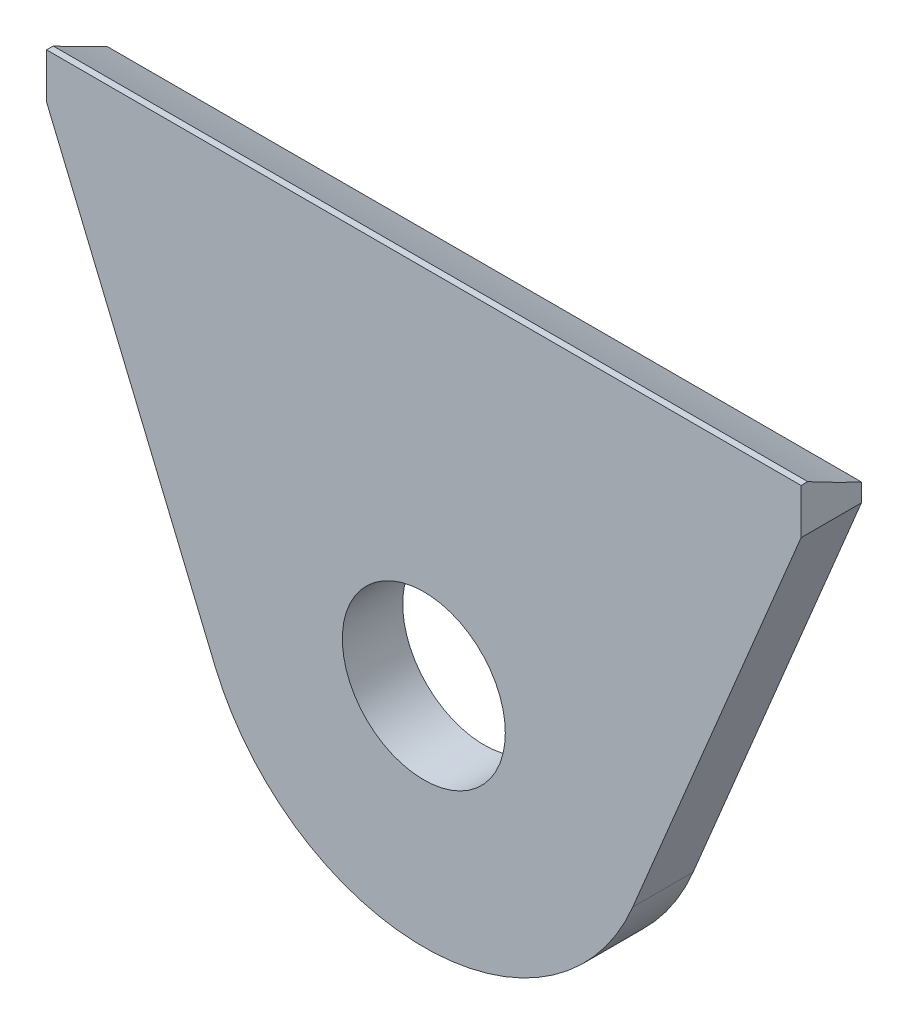
ISO-10303-21;
HEADER;
FILE_DESCRIPTION(('STEP AP214'),'2;1');
FILE_NAME('part.step','',(''),(''),'','','');
FILE_SCHEMA(('AUTOMOTIVE_DESIGN { 1 0 10303 214 1 1 1 1 }'));
ENDSEC;
DATA;
#1=APPLICATION_CONTEXT('core data for automotive mechanical design processes');
#2=APPLICATION_PROTOCOL_DEFINITION('international standard','automotive_design',2000,#1);
#3=PRODUCT_CONTEXT('',#1,'mechanical');
#4=PRODUCT('Part','Part','',(#3));
#5=PRODUCT_RELATED_PRODUCT_CATEGORY('part','',(#4));
#6=PRODUCT_DEFINITION_FORMATION('','',#4);
#7=PRODUCT_DEFINITION_CONTEXT('part definition',#1,'design');
#8=PRODUCT_DEFINITION('design','',#6,#7);
#9=PRODUCT_DEFINITION_SHAPE('','',#8);
#10=(LENGTH_UNIT() NAMED_UNIT(*) SI_UNIT(.MILLI.,.METRE.));
#11=(NAMED_UNIT(*) PLANE_ANGLE_UNIT() SI_UNIT($,.RADIAN.));
#12=(NAMED_UNIT(*) SI_UNIT($,.STERADIAN.) SOLID_ANGLE_UNIT());
#13=UNCERTAINTY_MEASURE_WITH_UNIT(LENGTH_MEASURE(1.E-05),#10,'distance_accuracy_value','');
#14=(GEOMETRIC_REPRESENTATION_CONTEXT(3) GLOBAL_UNCERTAINTY_ASSIGNED_CONTEXT((#13)) GLOBAL_UNIT_ASSIGNED_CONTEXT((#10,
#11,#12)) REPRESENTATION_CONTEXT('',''));
#15=CARTESIAN_POINT('',(0.,0.,0.));
#16=DIRECTION('',(0.,0.,1.));
#17=DIRECTION('',(1.,0.,0.));
#18=AXIS2_PLACEMENT_3D('',#15,#16,#17);
#19=CARTESIAN_POINT('',(25.,24.,4.));
#20=DIRECTION('',(-1.,0.,0.));
#21=DIRECTION('',(0.,0.,1.));
#22=AXIS2_PLACEMENT_3D('',#19,#20,#21);
#23=PLANE('',#22);
#24=CARTESIAN_POINT('',(25.,86.,-30.));
#25=DIRECTION('',(1.,0.,0.));
#26=DIRECTION('',(0.,0.,-1.));
#27=AXIS2_PLACEMENT_3D('',#24,#25,#26);
#28=CIRCLE('',#27,70.5);
#29=CARTESIAN_POINT('',(25.,24.,3.5596483890997));
#30=VERTEX_POINT('',#29);
#31=CARTESIAN_POINT('',(25.,22.2014890455898,0.));
#32=VERTEX_POINT('',#31);
#33=EDGE_CURVE('E121',#30,#32,#28,.T.);
#34=ORIENTED_EDGE('',*,*,#33,.F.);
#35=DIRECTION('',(0.,0.,-1.));
#36=VECTOR('',#35,1.);
#37=CARTESIAN_POINT('',(25.,24.,4.));
#38=LINE('',#37,#36);
#39=CARTESIAN_POINT('',(25.,24.,4.));
#40=VERTEX_POINT('',#39);
#41=EDGE_CURVE('E120',#40,#30,#38,.T.);
#42=ORIENTED_EDGE('',*,*,#41,.F.);
#43=DIRECTION('',(0.,1.,0.));
#44=VECTOR('',#43,1.);
#45=CARTESIAN_POINT('',(25.,24.,4.));
#46=LINE('',#45,#44);
#47=CARTESIAN_POINT('',(25.,21.,4.));
#48=VERTEX_POINT('',#47);
#49=EDGE_CURVE('E105',#48,#40,#46,.T.);
#50=ORIENTED_EDGE('',*,*,#49,.F.);
#51=DIRECTION('',(0.,0.,-1.));
#52=VECTOR('',#51,1.);
#53=CARTESIAN_POINT('',(25.,21.,4.));
#54=LINE('',#53,#52);
#55=CARTESIAN_POINT('',(25.,21.,0.));
#56=VERTEX_POINT('',#55);
#57=EDGE_CURVE('E123',#48,#56,#54,.T.);
#58=ORIENTED_EDGE('',*,*,#57,.T.);
#59=DIRECTION('',(0.,1.,0.));
#60=VECTOR('',#59,1.);
#61=CARTESIAN_POINT('',(25.,24.,0.));
#62=LINE('',#61,#60);
#63=EDGE_CURVE('E142',#56,#32,#62,.T.);
#64=ORIENTED_EDGE('',*,*,#63,.T.);
#65=EDGE_LOOP('',(#34,#42,#50,#58,#64));
#66=FACE_BOUND('',#65,.T.);
#67=ADVANCED_FACE('F41',(#66),#23,.F.);
#68=CARTESIAN_POINT('',(0.,0.,4.));
#69=DIRECTION('',(0.,0.,1.));
#70=DIRECTION('',(1.,0.,0.));
#71=AXIS2_PLACEMENT_3D('',#68,#69,#70);
#72=PLANE('',#71);
#73=DIRECTION('',(0.384615384615385,-0.923076923076923,0.));
#74=VECTOR('',#73,1.);
#75=CARTESIAN_POINT('',(-25.,21.,4.));
#76=LINE('',#75,#74);
#77=CARTESIAN_POINT('',(-25.,21.,4.));
#78=VERTEX_POINT('',#77);
#79=CARTESIAN_POINT('',(-13.8461538461538,-5.76923076923077,4.));
#80=VERTEX_POINT('',#79);
#81=EDGE_CURVE('E141',#78,#80,#76,.T.);
#82=ORIENTED_EDGE('',*,*,#81,.T.);
#83=CARTESIAN_POINT('',(0.,0.,4.));
#84=DIRECTION('',(0.,0.,1.));
#85=DIRECTION('',(1.,0.,0.));
#86=AXIS2_PLACEMENT_3D('',#83,#84,#85);
#87=CIRCLE('',#86,15.);
#88=CARTESIAN_POINT('',(13.8461538461538,-5.76923076923077,4.));
#89=VERTEX_POINT('',#88);
#90=EDGE_CURVE('E94',#80,#89,#87,.T.);
#91=ORIENTED_EDGE('',*,*,#90,.T.);
#92=DIRECTION('',(0.384615384615385,0.923076923076923,0.));
#93=VECTOR('',#92,1.);
#94=CARTESIAN_POINT('',(25.,21.,4.));
#95=LINE('',#94,#93);
#96=EDGE_CURVE('E109',#89,#48,#95,.T.);
#97=ORIENTED_EDGE('',*,*,#96,.T.);
#98=ORIENTED_EDGE('',*,*,#49,.T.);
#99=DIRECTION('',(-1.,0.,0.));
#100=VECTOR('',#99,1.);
#101=CARTESIAN_POINT('',(-25.,24.,4.));
#102=LINE('',#101,#100);
#103=CARTESIAN_POINT('',(-25.,24.,4.));
#104=VERTEX_POINT('',#103);
#105=EDGE_CURVE('E107',#40,#104,#102,.T.);
#106=ORIENTED_EDGE('',*,*,#105,.T.);
#107=DIRECTION('',(0.,-1.,0.));
#108=VECTOR('',#107,1.);
#109=CARTESIAN_POINT('',(-25.,24.,4.));
#110=LINE('',#109,#108);
#111=EDGE_CURVE('E63',#104,#78,#110,.T.);
#112=ORIENTED_EDGE('',*,*,#111,.T.);
#113=EDGE_LOOP('',(#82,#91,#97,#98,#106,#112));
#114=FACE_BOUND('',#113,.T.);
#115=CARTESIAN_POINT('',(0.,0.,4.));
#116=DIRECTION('',(0.,0.,1.));
#117=DIRECTION('',(1.,0.,0.));
#118=AXIS2_PLACEMENT_3D('',#115,#116,#117);
#119=CIRCLE('',#118,5.4);
#120=CARTESIAN_POINT('',(5.4,0.,4.));
#121=VERTEX_POINT('',#120);
#122=EDGE_CURVE('E140',#121,#121,#119,.T.);
#123=ORIENTED_EDGE('',*,*,#122,.F.);
#124=EDGE_LOOP('',(#123));
#125=FACE_BOUND('',#124,.T.);
#126=ADVANCED_FACE('F104',(#114,#125),#72,.T.);
#127=CARTESIAN_POINT('',(0.,0.,0.));
#128=DIRECTION('',(0.,0.,1.));
#129=DIRECTION('',(1.,0.,0.));
#130=AXIS2_PLACEMENT_3D('',#127,#128,#129);
#131=PLANE('',#130);
#132=DIRECTION('',(0.,-1.,0.));
#133=VECTOR('',#132,1.);
#134=CARTESIAN_POINT('',(-25.,24.,0.));
#135=LINE('',#134,#133);
#136=CARTESIAN_POINT('',(-25.,22.2014890455898,0.));
#137=VERTEX_POINT('',#136);
#138=CARTESIAN_POINT('',(-25.,21.,0.));
#139=VERTEX_POINT('',#138);
#140=EDGE_CURVE('E83',#137,#139,#135,.T.);
#141=ORIENTED_EDGE('',*,*,#140,.F.);
#142=DIRECTION('',(1.,0.,0.));
#143=VECTOR('',#142,1.);
#144=CARTESIAN_POINT('',(-25.,22.2014890455898,0.));
#145=LINE('',#144,#143);
#146=EDGE_CURVE('E160',#137,#32,#145,.T.);
#147=ORIENTED_EDGE('',*,*,#146,.T.);
#148=ORIENTED_EDGE('',*,*,#63,.F.);
#149=DIRECTION('',(0.384615384615385,0.923076923076923,0.));
#150=VECTOR('',#149,1.);
#151=CARTESIAN_POINT('',(25.,21.,0.));
#152=LINE('',#151,#150);
#153=CARTESIAN_POINT('',(13.8461538461538,-5.76923076923077,0.));
#154=VERTEX_POINT('',#153);
#155=EDGE_CURVE('E136',#154,#56,#152,.T.);
#156=ORIENTED_EDGE('',*,*,#155,.F.);
#157=CARTESIAN_POINT('',(0.,0.,0.));
#158=DIRECTION('',(0.,0.,1.));
#159=DIRECTION('',(1.,0.,0.));
#160=AXIS2_PLACEMENT_3D('',#157,#158,#159);
#161=CIRCLE('',#160,15.);
#162=CARTESIAN_POINT('',(-13.8461538461538,-5.76923076923077,0.));
#163=VERTEX_POINT('',#162);
#164=EDGE_CURVE('E137',#163,#154,#161,.T.);
#165=ORIENTED_EDGE('',*,*,#164,.F.);
#166=DIRECTION('',(0.384615384615385,-0.923076923076923,0.));
#167=VECTOR('',#166,1.);
#168=CARTESIAN_POINT('',(-25.,21.,0.));
#169=LINE('',#168,#167);
#170=EDGE_CURVE('E134',#139,#163,#169,.T.);
#171=ORIENTED_EDGE('',*,*,#170,.F.);
#172=EDGE_LOOP('',(#141,#147,#148,#156,#165,#171));
#173=FACE_BOUND('',#172,.T.);
#174=CARTESIAN_POINT('',(0.,0.,0.));
#175=DIRECTION('',(0.,0.,1.));
#176=DIRECTION('',(1.,0.,0.));
#177=AXIS2_PLACEMENT_3D('',#174,#175,#176);
#178=CIRCLE('',#177,5.4);
#179=CARTESIAN_POINT('',(5.4,0.,0.));
#180=VERTEX_POINT('',#179);
#181=EDGE_CURVE('E165',#180,#180,#178,.T.);
#182=ORIENTED_EDGE('',*,*,#181,.T.);
#183=EDGE_LOOP('',(#182));
#184=FACE_BOUND('',#183,.T.);
#185=ADVANCED_FACE('F153',(#173,#184),#131,.F.);
#186=CARTESIAN_POINT('',(-25.,21.,4.));
#187=DIRECTION('',(0.923076923076923,0.384615384615385,0.));
#188=DIRECTION('',(-0.384615384615385,0.923076923076923,0.));
#189=AXIS2_PLACEMENT_3D('',#186,#187,#188);
#190=PLANE('',#189);
#191=ORIENTED_EDGE('',*,*,#170,.T.);
#192=DIRECTION('',(0.,0.,-1.));
#193=VECTOR('',#192,1.);
#194=CARTESIAN_POINT('',(-13.8461538461538,-5.76923076923077,4.));
#195=LINE('',#194,#193);
#196=EDGE_CURVE('E11',#80,#163,#195,.T.);
#197=ORIENTED_EDGE('',*,*,#196,.F.);
#198=ORIENTED_EDGE('',*,*,#81,.F.);
#199=DIRECTION('',(0.,0.,-1.));
#200=VECTOR('',#199,1.);
#201=CARTESIAN_POINT('',(-25.,21.,4.));
#202=LINE('',#201,#200);
#203=EDGE_CURVE('E128',#78,#139,#202,.T.);
#204=ORIENTED_EDGE('',*,*,#203,.T.);
#205=EDGE_LOOP('',(#191,#197,#198,#204));
#206=FACE_BOUND('',#205,.T.);
#207=ADVANCED_FACE('F43',(#206),#190,.F.);
#208=CARTESIAN_POINT('',(0.,0.,4.));
#209=DIRECTION('',(0.,0.,-1.));
#210=DIRECTION('',(-1.,0.,0.));
#211=AXIS2_PLACEMENT_3D('',#208,#209,#210);
#212=CYLINDRICAL_SURFACE('',#211,15.);
#213=ORIENTED_EDGE('',*,*,#164,.T.);
#214=DIRECTION('',(0.,0.,-1.));
#215=VECTOR('',#214,1.);
#216=CARTESIAN_POINT('',(13.8461538461538,-5.76923076923077,4.));
#217=LINE('',#216,#215);
#218=EDGE_CURVE('E47',#89,#154,#217,.T.);
#219=ORIENTED_EDGE('',*,*,#218,.F.);
#220=ORIENTED_EDGE('',*,*,#90,.F.);
#221=ORIENTED_EDGE('',*,*,#196,.T.);
#222=EDGE_LOOP('',(#213,#219,#220,#221));
#223=FACE_BOUND('',#222,.T.);
#224=ADVANCED_FACE('F198',(#223),#212,.T.);
#225=CARTESIAN_POINT('',(25.,21.,4.));
#226=DIRECTION('',(-0.923076923076923,0.384615384615385,0.));
#227=DIRECTION('',(-0.384615384615385,-0.923076923076923,0.));
#228=AXIS2_PLACEMENT_3D('',#225,#226,#227);
#229=PLANE('',#228);
#230=ORIENTED_EDGE('',*,*,#155,.T.);
#231=ORIENTED_EDGE('',*,*,#57,.F.);
#232=ORIENTED_EDGE('',*,*,#96,.F.);
#233=ORIENTED_EDGE('',*,*,#218,.T.);
#234=EDGE_LOOP('',(#230,#231,#232,#233));
#235=FACE_BOUND('',#234,.T.);
#236=ADVANCED_FACE('F147',(#235),#229,.F.);
#237=CARTESIAN_POINT('',(-25.,24.,4.));
#238=DIRECTION('',(0.,-1.,0.));
#239=DIRECTION('',(0.,0.,-1.));
#240=AXIS2_PLACEMENT_3D('',#237,#238,#239);
#241=PLANE('',#240);
#242=ORIENTED_EDGE('',*,*,#41,.T.);
#243=DIRECTION('',(1.,0.,0.));
#244=VECTOR('',#243,1.);
#245=CARTESIAN_POINT('',(-25.,24.,3.5596483890997));
#246=LINE('',#245,#244);
#247=CARTESIAN_POINT('',(-25.,24.,3.5596483890997));
#248=VERTEX_POINT('',#247);
#249=EDGE_CURVE('E159',#30,#248,#246,.F.);
#250=ORIENTED_EDGE('',*,*,#249,.T.);
#251=DIRECTION('',(0.,0.,-1.));
#252=VECTOR('',#251,1.);
#253=CARTESIAN_POINT('',(-25.,24.,4.));
#254=LINE('',#253,#252);
#255=EDGE_CURVE('E122',#104,#248,#254,.T.);
#256=ORIENTED_EDGE('',*,*,#255,.F.);
#257=ORIENTED_EDGE('',*,*,#105,.F.);
#258=EDGE_LOOP('',(#242,#250,#256,#257));
#259=FACE_BOUND('',#258,.T.);
#260=ADVANCED_FACE('F126',(#259),#241,.F.);
#261=CARTESIAN_POINT('',(-25.,24.,4.));
#262=DIRECTION('',(1.,0.,0.));
#263=DIRECTION('',(0.,0.,-1.));
#264=AXIS2_PLACEMENT_3D('',#261,#262,#263);
#265=PLANE('',#264);
#266=ORIENTED_EDGE('',*,*,#255,.T.);
#267=CARTESIAN_POINT('',(-25.,86.,-30.));
#268=DIRECTION('',(1.,0.,0.));
#269=DIRECTION('',(0.,0.,-1.));
#270=AXIS2_PLACEMENT_3D('',#267,#268,#269);
#271=CIRCLE('',#270,70.5);
#272=EDGE_CURVE('E57',#248,#137,#271,.T.);
#273=ORIENTED_EDGE('',*,*,#272,.T.);
#274=ORIENTED_EDGE('',*,*,#140,.T.);
#275=ORIENTED_EDGE('',*,*,#203,.F.);
#276=ORIENTED_EDGE('',*,*,#111,.F.);
#277=EDGE_LOOP('',(#266,#273,#274,#275,#276));
#278=FACE_BOUND('',#277,.T.);
#279=ADVANCED_FACE('F161',(#278),#265,.F.);
#280=CARTESIAN_POINT('',(0.,0.,4.));
#281=DIRECTION('',(0.,0.,-1.));
#282=DIRECTION('',(-1.,0.,0.));
#283=AXIS2_PLACEMENT_3D('',#280,#281,#282);
#284=CYLINDRICAL_SURFACE('',#283,5.4);
#285=ORIENTED_EDGE('',*,*,#122,.T.);
#286=EDGE_LOOP('',(#285));
#287=FACE_BOUND('',#286,.T.);
#288=ORIENTED_EDGE('',*,*,#181,.F.);
#289=EDGE_LOOP('',(#288));
#290=FACE_BOUND('',#289,.T.);
#291=ADVANCED_FACE('F179',(#287,#290),#284,.F.);
#292=CARTESIAN_POINT('',(-25.,86.,-30.));
#293=DIRECTION('',(1.,0.,0.));
#294=DIRECTION('',(0.,0.,-1.));
#295=AXIS2_PLACEMENT_3D('',#292,#293,#294);
#296=CYLINDRICAL_SURFACE('',#295,70.5);
#297=ORIENTED_EDGE('',*,*,#272,.F.);
#298=ORIENTED_EDGE('',*,*,#249,.F.);
#299=ORIENTED_EDGE('',*,*,#33,.T.);
#300=ORIENTED_EDGE('',*,*,#146,.F.);
#301=EDGE_LOOP('',(#297,#298,#299,#300));
#302=FACE_BOUND('',#301,.T.);
#303=ADVANCED_FACE('F162',(#302),#296,.F.);
#304=CLOSED_SHELL('',(#67,#126,#185,#207,#224,#236,#260,#279,#291,#303));
#305=MANIFOLD_SOLID_BREP('B2',#304);
#306=ADVANCED_BREP_SHAPE_REPRESENTATION('',(#18,#305),#14);
#307=SHAPE_DEFINITION_REPRESENTATION(#9,#306);
ENDSEC;
END-ISO-10303-21;
